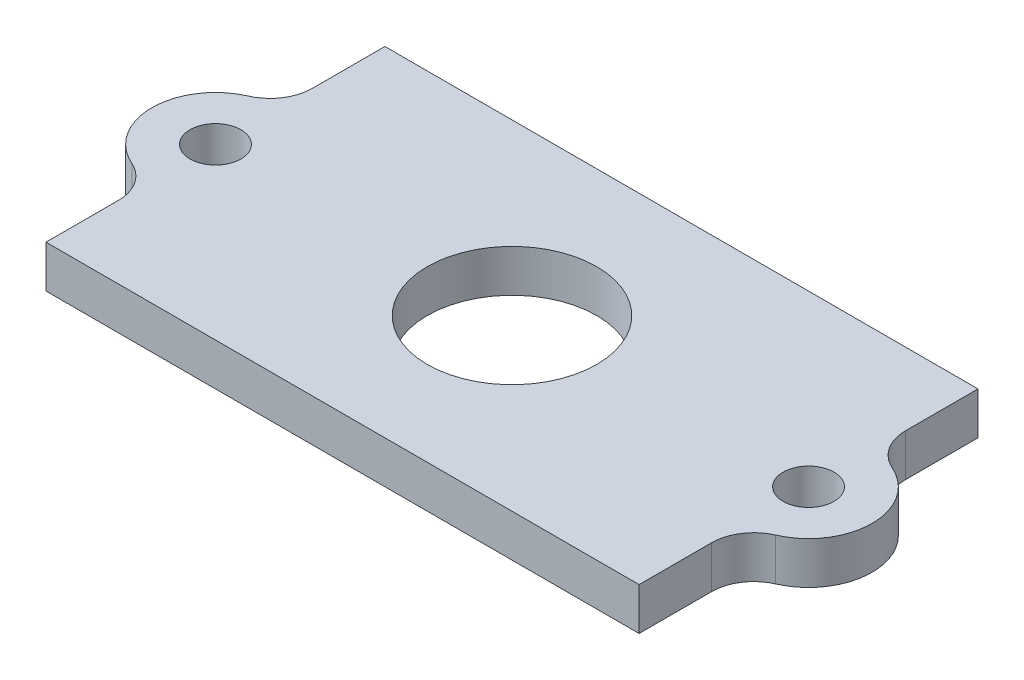
ISO-10303-21;
HEADER;
FILE_DESCRIPTION(('STEP AP214'),'2;1');
FILE_NAME('part.step','',(''),(''),'','','');
FILE_SCHEMA(('AUTOMOTIVE_DESIGN { 1 0 10303 214 1 1 1 1 }'));
ENDSEC;
DATA;
#1=APPLICATION_CONTEXT('core data for automotive mechanical design processes');
#2=APPLICATION_PROTOCOL_DEFINITION('international standard','automotive_design',2000,#1);
#3=PRODUCT_CONTEXT('',#1,'mechanical');
#4=PRODUCT('Part','Part','',(#3));
#5=PRODUCT_RELATED_PRODUCT_CATEGORY('part','',(#4));
#6=PRODUCT_DEFINITION_FORMATION('','',#4);
#7=PRODUCT_DEFINITION_CONTEXT('part definition',#1,'design');
#8=PRODUCT_DEFINITION('design','',#6,#7);
#9=PRODUCT_DEFINITION_SHAPE('','',#8);
#10=(LENGTH_UNIT() NAMED_UNIT(*) SI_UNIT(.MILLI.,.METRE.));
#11=(NAMED_UNIT(*) PLANE_ANGLE_UNIT() SI_UNIT($,.RADIAN.));
#12=(NAMED_UNIT(*) SI_UNIT($,.STERADIAN.) SOLID_ANGLE_UNIT());
#13=UNCERTAINTY_MEASURE_WITH_UNIT(LENGTH_MEASURE(1.E-05),#10,'distance_accuracy_value','');
#14=(GEOMETRIC_REPRESENTATION_CONTEXT(3) GLOBAL_UNCERTAINTY_ASSIGNED_CONTEXT((#13)) GLOBAL_UNIT_ASSIGNED_CONTEXT((#10,
#11,#12)) REPRESENTATION_CONTEXT('',''));
#15=CARTESIAN_POINT('',(0.,0.,0.));
#16=DIRECTION('',(0.,0.,1.));
#17=DIRECTION('',(1.,0.,0.));
#18=AXIS2_PLACEMENT_3D('',#15,#16,#17);
#19=CARTESIAN_POINT('',(-7.,0.,4.));
#20=DIRECTION('',(1.,0.,0.));
#21=DIRECTION('',(0.,0.,-1.));
#22=AXIS2_PLACEMENT_3D('',#19,#20,#21);
#23=PLANE('',#22);
#24=DIRECTION('',(0.,-1.,0.));
#25=VECTOR('',#24,1.);
#26=CARTESIAN_POINT('',(-7.,0.,4.));
#27=LINE('',#26,#25);
#28=CARTESIAN_POINT('',(-7.,1.,4.));
#29=VERTEX_POINT('',#28);
#30=CARTESIAN_POINT('',(-7.,0.,4.));
#31=VERTEX_POINT('',#30);
#32=EDGE_CURVE('E211',#29,#31,#27,.T.);
#33=ORIENTED_EDGE('',*,*,#32,.F.);
#34=DIRECTION('',(0.,0.,1.));
#35=VECTOR('',#34,1.);
#36=CARTESIAN_POINT('',(-7.,1.,0.));
#37=LINE('',#36,#35);
#38=CARTESIAN_POINT('',(-7.,1.,2.29128784747792));
#39=VERTEX_POINT('',#38);
#40=EDGE_CURVE('E136',#39,#29,#37,.T.);
#41=ORIENTED_EDGE('',*,*,#40,.F.);
#42=DIRECTION('',(0.,-1.,0.));
#43=VECTOR('',#42,1.);
#44=CARTESIAN_POINT('',(-7.,0.,2.29128784747792));
#45=LINE('',#44,#43);
#46=CARTESIAN_POINT('',(-7.,0.,2.29128784747792));
#47=VERTEX_POINT('',#46);
#48=EDGE_CURVE('E181',#39,#47,#45,.T.);
#49=ORIENTED_EDGE('',*,*,#48,.T.);
#50=DIRECTION('',(0.,0.,-1.));
#51=VECTOR('',#50,1.);
#52=CARTESIAN_POINT('',(-7.,0.,4.));
#53=LINE('',#52,#51);
#54=EDGE_CURVE('E158',#31,#47,#53,.T.);
#55=ORIENTED_EDGE('',*,*,#54,.F.);
#56=EDGE_LOOP('',(#33,#41,#49,#55));
#57=FACE_BOUND('',#56,.T.);
#58=ADVANCED_FACE('F38',(#57),#23,.F.);
#59=CARTESIAN_POINT('',(7.,8.,4.));
#60=DIRECTION('',(-1.,0.,0.));
#61=DIRECTION('',(0.,-1.,0.));
#62=AXIS2_PLACEMENT_3D('',#59,#60,#61);
#63=PLANE('',#62);
#64=DIRECTION('',(0.,1.,0.));
#65=VECTOR('',#64,1.);
#66=CARTESIAN_POINT('',(7.,8.,-4.));
#67=LINE('',#66,#65);
#68=CARTESIAN_POINT('',(7.,0.,-4.));
#69=VERTEX_POINT('',#68);
#70=CARTESIAN_POINT('',(7.,1.,-4.));
#71=VERTEX_POINT('',#70);
#72=EDGE_CURVE('E135',#69,#71,#67,.T.);
#73=ORIENTED_EDGE('',*,*,#72,.T.);
#74=DIRECTION('',(0.,0.,1.));
#75=VECTOR('',#74,1.);
#76=CARTESIAN_POINT('',(7.,1.,0.));
#77=LINE('',#76,#75);
#78=CARTESIAN_POINT('',(7.,1.,-2.29128784747792));
#79=VERTEX_POINT('',#78);
#80=EDGE_CURVE('E142',#71,#79,#77,.T.);
#81=ORIENTED_EDGE('',*,*,#80,.T.);
#82=DIRECTION('',(0.,1.,0.));
#83=VECTOR('',#82,1.);
#84=CARTESIAN_POINT('',(7.,0.,-2.29128784747792));
#85=LINE('',#84,#83);
#86=CARTESIAN_POINT('',(7.,0.,-2.29128784747792));
#87=VERTEX_POINT('',#86);
#88=EDGE_CURVE('E172',#79,#87,#85,.F.);
#89=ORIENTED_EDGE('',*,*,#88,.T.);
#90=DIRECTION('',(0.,0.,-1.));
#91=VECTOR('',#90,1.);
#92=CARTESIAN_POINT('',(7.,0.,4.));
#93=LINE('',#92,#91);
#94=EDGE_CURVE('E161',#87,#69,#93,.T.);
#95=ORIENTED_EDGE('',*,*,#94,.T.);
#96=EDGE_LOOP('',(#73,#81,#89,#95));
#97=FACE_BOUND('',#96,.T.);
#98=ADVANCED_FACE('F257',(#97),#63,.F.);
#99=CARTESIAN_POINT('',(7.,1.,2.29128784747792));
#100=VERTEX_POINT('',#99);
#101=CARTESIAN_POINT('',(7.,1.,4.));
#102=VERTEX_POINT('',#101);
#103=EDGE_CURVE('E214',#100,#102,#77,.T.);
#104=ORIENTED_EDGE('',*,*,#103,.T.);
#105=DIRECTION('',(0.,1.,0.));
#106=VECTOR('',#105,1.);
#107=CARTESIAN_POINT('',(7.,8.,4.));
#108=LINE('',#107,#106);
#109=CARTESIAN_POINT('',(7.,0.,4.));
#110=VERTEX_POINT('',#109);
#111=EDGE_CURVE('E220',#110,#102,#108,.T.);
#112=ORIENTED_EDGE('',*,*,#111,.F.);
#113=CARTESIAN_POINT('',(7.,0.,2.29128784747792));
#114=VERTEX_POINT('',#113);
#115=EDGE_CURVE('E163',#110,#114,#93,.T.);
#116=ORIENTED_EDGE('',*,*,#115,.T.);
#117=DIRECTION('',(0.,1.,0.));
#118=VECTOR('',#117,1.);
#119=CARTESIAN_POINT('',(7.,1.,2.29128784747792));
#120=LINE('',#119,#118);
#121=EDGE_CURVE('E174',#114,#100,#120,.T.);
#122=ORIENTED_EDGE('',*,*,#121,.T.);
#123=EDGE_LOOP('',(#104,#112,#116,#122));
#124=FACE_BOUND('',#123,.T.);
#125=ADVANCED_FACE('F238',(#124),#63,.F.);
#126=CARTESIAN_POINT('',(-7.,1.,-4.));
#127=VERTEX_POINT('',#126);
#128=CARTESIAN_POINT('',(-7.,1.,-2.29128784747792));
#129=VERTEX_POINT('',#128);
#130=EDGE_CURVE('E126',#127,#129,#37,.T.);
#131=ORIENTED_EDGE('',*,*,#130,.F.);
#132=DIRECTION('',(0.,-1.,0.));
#133=VECTOR('',#132,1.);
#134=CARTESIAN_POINT('',(-7.,0.,-4.));
#135=LINE('',#134,#133);
#136=CARTESIAN_POINT('',(-7.,0.,-4.));
#137=VERTEX_POINT('',#136);
#138=EDGE_CURVE('E131',#127,#137,#135,.T.);
#139=ORIENTED_EDGE('',*,*,#138,.T.);
#140=CARTESIAN_POINT('',(-7.,0.,-2.29128784747792));
#141=VERTEX_POINT('',#140);
#142=EDGE_CURVE('E162',#141,#137,#53,.T.);
#143=ORIENTED_EDGE('',*,*,#142,.F.);
#144=DIRECTION('',(0.,-1.,0.));
#145=VECTOR('',#144,1.);
#146=CARTESIAN_POINT('',(-7.,0.,-2.29128784747792));
#147=LINE('',#146,#145);
#148=EDGE_CURVE('E134',#141,#129,#147,.F.);
#149=ORIENTED_EDGE('',*,*,#148,.T.);
#150=EDGE_LOOP('',(#131,#139,#143,#149));
#151=FACE_BOUND('',#150,.T.);
#152=ADVANCED_FACE('F128',(#151),#23,.F.);
#153=CARTESIAN_POINT('',(0.,0.,4.));
#154=DIRECTION('',(0.,0.,-1.));
#155=DIRECTION('',(-1.,0.,0.));
#156=AXIS2_PLACEMENT_3D('',#153,#154,#155);
#157=PLANE('',#156);
#158=DIRECTION('',(1.,0.,0.));
#159=VECTOR('',#158,1.);
#160=CARTESIAN_POINT('',(0.,1.,4.));
#161=LINE('',#160,#159);
#162=EDGE_CURVE('E146',#29,#102,#161,.T.);
#163=ORIENTED_EDGE('',*,*,#162,.F.);
#164=ORIENTED_EDGE('',*,*,#32,.T.);
#165=DIRECTION('',(1.,0.,0.));
#166=VECTOR('',#165,1.);
#167=CARTESIAN_POINT('',(7.,0.,4.));
#168=LINE('',#167,#166);
#169=EDGE_CURVE('E153',#31,#110,#168,.T.);
#170=ORIENTED_EDGE('',*,*,#169,.T.);
#171=ORIENTED_EDGE('',*,*,#111,.T.);
#172=EDGE_LOOP('',(#163,#164,#170,#171));
#173=FACE_BOUND('',#172,.T.);
#174=ADVANCED_FACE('F243',(#173),#157,.F.);
#175=CARTESIAN_POINT('',(0.,0.,-4.));
#176=DIRECTION('',(0.,0.,-1.));
#177=DIRECTION('',(-1.,0.,0.));
#178=AXIS2_PLACEMENT_3D('',#175,#176,#177);
#179=PLANE('',#178);
#180=ORIENTED_EDGE('',*,*,#138,.F.);
#181=DIRECTION('',(1.,0.,0.));
#182=VECTOR('',#181,1.);
#183=CARTESIAN_POINT('',(0.,1.,-4.));
#184=LINE('',#183,#182);
#185=EDGE_CURVE('E139',#127,#71,#184,.T.);
#186=ORIENTED_EDGE('',*,*,#185,.T.);
#187=ORIENTED_EDGE('',*,*,#72,.F.);
#188=DIRECTION('',(1.,0.,0.));
#189=VECTOR('',#188,1.);
#190=CARTESIAN_POINT('',(0.,0.,-4.));
#191=LINE('',#190,#189);
#192=EDGE_CURVE('E151',#137,#69,#191,.T.);
#193=ORIENTED_EDGE('',*,*,#192,.F.);
#194=EDGE_LOOP('',(#180,#186,#187,#193));
#195=FACE_BOUND('',#194,.T.);
#196=ADVANCED_FACE('F149',(#195),#179,.T.);
#197=CARTESIAN_POINT('',(0.,0.,4.));
#198=DIRECTION('',(0.,1.,0.));
#199=DIRECTION('',(-1.,0.,0.));
#200=AXIS2_PLACEMENT_3D('',#197,#198,#199);
#201=PLANE('',#200);
#202=CARTESIAN_POINT('',(0.,0.,0.));
#203=DIRECTION('',(0.,-1.,0.));
#204=DIRECTION('',(1.,0.,0.));
#205=AXIS2_PLACEMENT_3D('',#202,#203,#204);
#206=CIRCLE('',#205,2.);
#207=CARTESIAN_POINT('',(2.,0.,0.));
#208=VERTEX_POINT('',#207);
#209=EDGE_CURVE('E241',#208,#208,#206,.T.);
#210=ORIENTED_EDGE('',*,*,#209,.F.);
#211=EDGE_LOOP('',(#210));
#212=FACE_BOUND('',#211,.T.);
#213=CARTESIAN_POINT('',(-7.,0.,0.));
#214=DIRECTION('',(0.,-1.,0.));
#215=DIRECTION('',(1.,0.,0.));
#216=AXIS2_PLACEMENT_3D('',#213,#214,#215);
#217=CIRCLE('',#216,0.6);
#218=CARTESIAN_POINT('',(-6.4,0.,0.));
#219=VERTEX_POINT('',#218);
#220=EDGE_CURVE('E313',#219,#219,#217,.T.);
#221=ORIENTED_EDGE('',*,*,#220,.F.);
#222=EDGE_LOOP('',(#221));
#223=FACE_BOUND('',#222,.T.);
#224=CARTESIAN_POINT('',(7.,0.,0.));
#225=DIRECTION('',(0.,-1.,0.));
#226=DIRECTION('',(1.,0.,0.));
#227=AXIS2_PLACEMENT_3D('',#224,#225,#226);
#228=CIRCLE('',#227,0.6);
#229=CARTESIAN_POINT('',(7.6,0.,0.));
#230=VERTEX_POINT('',#229);
#231=EDGE_CURVE('E231',#230,#230,#228,.T.);
#232=ORIENTED_EDGE('',*,*,#231,.F.);
#233=EDGE_LOOP('',(#232));
#234=FACE_BOUND('',#233,.T.);
#235=ORIENTED_EDGE('',*,*,#54,.T.);
#236=CARTESIAN_POINT('',(-8.,0.,2.29128784747792));
#237=DIRECTION('',(0.,1.,0.));
#238=DIRECTION('',(-1.,0.,0.));
#239=AXIS2_PLACEMENT_3D('',#236,#237,#238);
#240=CIRCLE('',#239,1.);
#241=CARTESIAN_POINT('',(-7.6,0.,1.37477270848675));
#242=VERTEX_POINT('',#241);
#243=EDGE_CURVE('E46',#47,#242,#240,.T.);
#244=ORIENTED_EDGE('',*,*,#243,.T.);
#245=CARTESIAN_POINT('',(-7.,0.,0.));
#246=DIRECTION('',(0.,-1.,0.));
#247=DIRECTION('',(1.,0.,0.));
#248=AXIS2_PLACEMENT_3D('',#245,#246,#247);
#249=CIRCLE('',#248,1.5);
#250=CARTESIAN_POINT('',(-7.6,0.,-1.37477270848675));
#251=VERTEX_POINT('',#250);
#252=EDGE_CURVE('E198',#242,#251,#249,.T.);
#253=ORIENTED_EDGE('',*,*,#252,.T.);
#254=CARTESIAN_POINT('',(-8.,0.,-2.29128784747792));
#255=DIRECTION('',(0.,1.,0.));
#256=DIRECTION('',(-1.,0.,0.));
#257=AXIS2_PLACEMENT_3D('',#254,#255,#256);
#258=CIRCLE('',#257,1.);
#259=EDGE_CURVE('E193',#251,#141,#258,.T.);
#260=ORIENTED_EDGE('',*,*,#259,.T.);
#261=ORIENTED_EDGE('',*,*,#142,.T.);
#262=ORIENTED_EDGE('',*,*,#192,.T.);
#263=ORIENTED_EDGE('',*,*,#94,.F.);
#264=CARTESIAN_POINT('',(8.,0.,-2.29128784747792));
#265=DIRECTION('',(0.,1.,0.));
#266=DIRECTION('',(-1.,0.,0.));
#267=AXIS2_PLACEMENT_3D('',#264,#265,#266);
#268=CIRCLE('',#267,1.);
#269=CARTESIAN_POINT('',(7.6,0.,-1.37477270848675));
#270=VERTEX_POINT('',#269);
#271=EDGE_CURVE('E185',#87,#270,#268,.T.);
#272=ORIENTED_EDGE('',*,*,#271,.T.);
#273=CARTESIAN_POINT('',(7.,0.,0.));
#274=DIRECTION('',(0.,-1.,0.));
#275=DIRECTION('',(1.,0.,0.));
#276=AXIS2_PLACEMENT_3D('',#273,#274,#275);
#277=CIRCLE('',#276,1.5);
#278=CARTESIAN_POINT('',(7.6,0.,1.37477270848675));
#279=VERTEX_POINT('',#278);
#280=EDGE_CURVE('E226',#279,#270,#277,.F.);
#281=ORIENTED_EDGE('',*,*,#280,.F.);
#282=CARTESIAN_POINT('',(8.,0.,2.29128784747792));
#283=DIRECTION('',(0.,1.,0.));
#284=DIRECTION('',(-1.,0.,0.));
#285=AXIS2_PLACEMENT_3D('',#282,#283,#284);
#286=CIRCLE('',#285,1.);
#287=EDGE_CURVE('E187',#279,#114,#286,.T.);
#288=ORIENTED_EDGE('',*,*,#287,.T.);
#289=ORIENTED_EDGE('',*,*,#115,.F.);
#290=ORIENTED_EDGE('',*,*,#169,.F.);
#291=EDGE_LOOP('',(#235,#244,#253,#260,#261,#262,#263,#272,#281,#288,#289,#290));
#292=FACE_BOUND('',#291,.T.);
#293=ADVANCED_FACE('F197',(#212,#223,#234,#292),#201,.F.);
#294=CARTESIAN_POINT('',(-7.,1.,0.));
#295=DIRECTION('',(0.,1.,0.));
#296=DIRECTION('',(0.,0.,1.));
#297=AXIS2_PLACEMENT_3D('',#294,#295,#296);
#298=PLANE('',#297);
#299=CARTESIAN_POINT('',(0.,1.,0.));
#300=DIRECTION('',(0.,-1.,0.));
#301=DIRECTION('',(1.,0.,0.));
#302=AXIS2_PLACEMENT_3D('',#299,#300,#301);
#303=CIRCLE('',#302,2.);
#304=CARTESIAN_POINT('',(2.,1.,0.));
#305=VERTEX_POINT('',#304);
#306=EDGE_CURVE('E318',#305,#305,#303,.T.);
#307=ORIENTED_EDGE('',*,*,#306,.T.);
#308=EDGE_LOOP('',(#307));
#309=FACE_BOUND('',#308,.T.);
#310=CARTESIAN_POINT('',(-7.,0.999999999999999,0.));
#311=DIRECTION('',(0.,-1.,0.));
#312=DIRECTION('',(1.,0.,0.));
#313=AXIS2_PLACEMENT_3D('',#310,#311,#312);
#314=CIRCLE('',#313,0.6);
#315=CARTESIAN_POINT('',(-6.4,0.999999999999999,0.));
#316=VERTEX_POINT('',#315);
#317=EDGE_CURVE('E207',#316,#316,#314,.T.);
#318=ORIENTED_EDGE('',*,*,#317,.T.);
#319=EDGE_LOOP('',(#318));
#320=FACE_BOUND('',#319,.T.);
#321=CARTESIAN_POINT('',(7.,1.,0.));
#322=DIRECTION('',(0.,-1.,0.));
#323=DIRECTION('',(1.,0.,0.));
#324=AXIS2_PLACEMENT_3D('',#321,#322,#323);
#325=CIRCLE('',#324,0.6);
#326=CARTESIAN_POINT('',(7.6,1.,0.));
#327=VERTEX_POINT('',#326);
#328=EDGE_CURVE('E317',#327,#327,#325,.T.);
#329=ORIENTED_EDGE('',*,*,#328,.T.);
#330=EDGE_LOOP('',(#329));
#331=FACE_BOUND('',#330,.T.);
#332=ORIENTED_EDGE('',*,*,#130,.T.);
#333=CARTESIAN_POINT('',(-8.,1.,-2.29128784747792));
#334=DIRECTION('',(0.,1.,0.));
#335=DIRECTION('',(0.,0.,1.));
#336=AXIS2_PLACEMENT_3D('',#333,#334,#335);
#337=CIRCLE('',#336,1.);
#338=CARTESIAN_POINT('',(-7.6,0.999999999999999,-1.37477270848675));
#339=VERTEX_POINT('',#338);
#340=EDGE_CURVE('E191',#129,#339,#337,.F.);
#341=ORIENTED_EDGE('',*,*,#340,.T.);
#342=CARTESIAN_POINT('',(-7.,0.999999999999999,0.));
#343=DIRECTION('',(0.,-1.,0.));
#344=DIRECTION('',(1.,0.,0.));
#345=AXIS2_PLACEMENT_3D('',#342,#343,#344);
#346=CIRCLE('',#345,1.5);
#347=CARTESIAN_POINT('',(-7.6,0.999999999999999,1.37477270848675));
#348=VERTEX_POINT('',#347);
#349=EDGE_CURVE('E206',#348,#339,#346,.T.);
#350=ORIENTED_EDGE('',*,*,#349,.F.);
#351=CARTESIAN_POINT('',(-8.,1.,2.29128784747792));
#352=DIRECTION('',(0.,1.,0.));
#353=DIRECTION('',(0.,0.,1.));
#354=AXIS2_PLACEMENT_3D('',#351,#352,#353);
#355=CIRCLE('',#354,1.);
#356=EDGE_CURVE('E11',#348,#39,#355,.F.);
#357=ORIENTED_EDGE('',*,*,#356,.T.);
#358=ORIENTED_EDGE('',*,*,#40,.T.);
#359=ORIENTED_EDGE('',*,*,#162,.T.);
#360=ORIENTED_EDGE('',*,*,#103,.F.);
#361=CARTESIAN_POINT('',(8.,1.,2.29128784747792));
#362=DIRECTION('',(0.,1.,0.));
#363=DIRECTION('',(0.,0.,1.));
#364=AXIS2_PLACEMENT_3D('',#361,#362,#363);
#365=CIRCLE('',#364,1.);
#366=CARTESIAN_POINT('',(7.6,1.,1.37477270848675));
#367=VERTEX_POINT('',#366);
#368=EDGE_CURVE('E189',#100,#367,#365,.F.);
#369=ORIENTED_EDGE('',*,*,#368,.T.);
#370=CARTESIAN_POINT('',(7.,1.,0.));
#371=DIRECTION('',(0.,-1.,0.));
#372=DIRECTION('',(1.,0.,0.));
#373=AXIS2_PLACEMENT_3D('',#370,#371,#372);
#374=CIRCLE('',#373,1.5);
#375=CARTESIAN_POINT('',(7.6,1.,-1.37477270848675));
#376=VERTEX_POINT('',#375);
#377=EDGE_CURVE('E229',#367,#376,#374,.F.);
#378=ORIENTED_EDGE('',*,*,#377,.T.);
#379=CARTESIAN_POINT('',(8.,1.,-2.29128784747792));
#380=DIRECTION('',(0.,1.,0.));
#381=DIRECTION('',(0.,0.,1.));
#382=AXIS2_PLACEMENT_3D('',#379,#380,#381);
#383=CIRCLE('',#382,1.);
#384=EDGE_CURVE('E183',#376,#79,#383,.F.);
#385=ORIENTED_EDGE('',*,*,#384,.T.);
#386=ORIENTED_EDGE('',*,*,#80,.F.);
#387=ORIENTED_EDGE('',*,*,#185,.F.);
#388=EDGE_LOOP('',(#332,#341,#350,#357,#358,#359,#360,#369,#378,#385,#386,#387));
#389=FACE_BOUND('',#388,.T.);
#390=ADVANCED_FACE('F140',(#309,#320,#331,#389),#298,.T.);
#391=CARTESIAN_POINT('',(7.,1.,0.));
#392=DIRECTION('',(0.,-1.,0.));
#393=DIRECTION('',(1.,0.,0.));
#394=AXIS2_PLACEMENT_3D('',#391,#392,#393);
#395=CYLINDRICAL_SURFACE('',#394,1.5);
#396=ORIENTED_EDGE('',*,*,#280,.T.);
#397=DIRECTION('',(0.,-1.,0.));
#398=VECTOR('',#397,1.);
#399=CARTESIAN_POINT('',(7.6,1.,-1.37477270848675));
#400=LINE('',#399,#398);
#401=EDGE_CURVE('E169',#270,#376,#400,.F.);
#402=ORIENTED_EDGE('',*,*,#401,.T.);
#403=ORIENTED_EDGE('',*,*,#377,.F.);
#404=DIRECTION('',(0.,-1.,0.));
#405=VECTOR('',#404,1.);
#406=CARTESIAN_POINT('',(7.6,1.,1.37477270848675));
#407=LINE('',#406,#405);
#408=EDGE_CURVE('E166',#367,#279,#407,.T.);
#409=ORIENTED_EDGE('',*,*,#408,.T.);
#410=EDGE_LOOP('',(#396,#402,#403,#409));
#411=FACE_BOUND('',#410,.T.);
#412=ADVANCED_FACE('F250',(#411),#395,.T.);
#413=CARTESIAN_POINT('',(-7.,0.999999999999999,0.));
#414=DIRECTION('',(0.,-1.,0.));
#415=DIRECTION('',(1.,0.,0.));
#416=AXIS2_PLACEMENT_3D('',#413,#414,#415);
#417=CYLINDRICAL_SURFACE('',#416,1.5);
#418=ORIENTED_EDGE('',*,*,#349,.T.);
#419=DIRECTION('',(0.,-1.,0.));
#420=VECTOR('',#419,1.);
#421=CARTESIAN_POINT('',(-7.6,0.999999999999999,-1.37477270848675));
#422=LINE('',#421,#420);
#423=EDGE_CURVE('E179',#339,#251,#422,.T.);
#424=ORIENTED_EDGE('',*,*,#423,.T.);
#425=ORIENTED_EDGE('',*,*,#252,.F.);
#426=DIRECTION('',(0.,-1.,0.));
#427=VECTOR('',#426,1.);
#428=CARTESIAN_POINT('',(-7.6,0.999999999999999,1.37477270848675));
#429=LINE('',#428,#427);
#430=EDGE_CURVE('E177',#242,#348,#429,.F.);
#431=ORIENTED_EDGE('',*,*,#430,.T.);
#432=EDGE_LOOP('',(#418,#424,#425,#431));
#433=FACE_BOUND('',#432,.T.);
#434=ADVANCED_FACE('F204',(#433),#417,.T.);
#435=CARTESIAN_POINT('',(7.,1.,0.));
#436=DIRECTION('',(0.,-1.,0.));
#437=DIRECTION('',(1.,0.,0.));
#438=AXIS2_PLACEMENT_3D('',#435,#436,#437);
#439=CYLINDRICAL_SURFACE('',#438,0.6);
#440=ORIENTED_EDGE('',*,*,#328,.F.);
#441=EDGE_LOOP('',(#440));
#442=FACE_BOUND('',#441,.T.);
#443=ORIENTED_EDGE('',*,*,#231,.T.);
#444=EDGE_LOOP('',(#443));
#445=FACE_BOUND('',#444,.T.);
#446=ADVANCED_FACE('F288',(#442,#445),#439,.F.);
#447=CARTESIAN_POINT('',(-7.,0.999999999999999,0.));
#448=DIRECTION('',(0.,-1.,0.));
#449=DIRECTION('',(1.,0.,0.));
#450=AXIS2_PLACEMENT_3D('',#447,#448,#449);
#451=CYLINDRICAL_SURFACE('',#450,0.6);
#452=ORIENTED_EDGE('',*,*,#317,.F.);
#453=EDGE_LOOP('',(#452));
#454=FACE_BOUND('',#453,.T.);
#455=ORIENTED_EDGE('',*,*,#220,.T.);
#456=EDGE_LOOP('',(#455));
#457=FACE_BOUND('',#456,.T.);
#458=ADVANCED_FACE('F269',(#454,#457),#451,.F.);
#459=CARTESIAN_POINT('',(8.,1.,-2.29128784747792));
#460=DIRECTION('',(0.,-1.,0.));
#461=DIRECTION('',(1.,0.,0.));
#462=AXIS2_PLACEMENT_3D('',#459,#460,#461);
#463=CYLINDRICAL_SURFACE('',#462,1.);
#464=ORIENTED_EDGE('',*,*,#271,.F.);
#465=ORIENTED_EDGE('',*,*,#88,.F.);
#466=ORIENTED_EDGE('',*,*,#384,.F.);
#467=ORIENTED_EDGE('',*,*,#401,.F.);
#468=EDGE_LOOP('',(#464,#465,#466,#467));
#469=FACE_BOUND('',#468,.T.);
#470=ADVANCED_FACE('F254',(#469),#463,.F.);
#471=CARTESIAN_POINT('',(8.,1.,2.29128784747792));
#472=DIRECTION('',(0.,-1.,0.));
#473=DIRECTION('',(1.,0.,0.));
#474=AXIS2_PLACEMENT_3D('',#471,#472,#473);
#475=CYLINDRICAL_SURFACE('',#474,1.);
#476=ORIENTED_EDGE('',*,*,#368,.F.);
#477=ORIENTED_EDGE('',*,*,#121,.F.);
#478=ORIENTED_EDGE('',*,*,#287,.F.);
#479=ORIENTED_EDGE('',*,*,#408,.F.);
#480=EDGE_LOOP('',(#476,#477,#478,#479));
#481=FACE_BOUND('',#480,.T.);
#482=ADVANCED_FACE('F247',(#481),#475,.F.);
#483=CARTESIAN_POINT('',(-8.,0.999999999999999,-2.29128784747792));
#484=DIRECTION('',(0.,-1.,0.));
#485=DIRECTION('',(1.,0.,0.));
#486=AXIS2_PLACEMENT_3D('',#483,#484,#485);
#487=CYLINDRICAL_SURFACE('',#486,1.);
#488=ORIENTED_EDGE('',*,*,#259,.F.);
#489=ORIENTED_EDGE('',*,*,#423,.F.);
#490=ORIENTED_EDGE('',*,*,#340,.F.);
#491=ORIENTED_EDGE('',*,*,#148,.F.);
#492=EDGE_LOOP('',(#488,#489,#490,#491));
#493=FACE_BOUND('',#492,.T.);
#494=ADVANCED_FACE('F225',(#493),#487,.F.);
#495=CARTESIAN_POINT('',(-8.,0.999999999999999,2.29128784747792));
#496=DIRECTION('',(0.,-1.,0.));
#497=DIRECTION('',(1.,0.,0.));
#498=AXIS2_PLACEMENT_3D('',#495,#496,#497);
#499=CYLINDRICAL_SURFACE('',#498,1.);
#500=ORIENTED_EDGE('',*,*,#356,.F.);
#501=ORIENTED_EDGE('',*,*,#430,.F.);
#502=ORIENTED_EDGE('',*,*,#243,.F.);
#503=ORIENTED_EDGE('',*,*,#48,.F.);
#504=EDGE_LOOP('',(#500,#501,#502,#503));
#505=FACE_BOUND('',#504,.T.);
#506=ADVANCED_FACE('F40',(#505),#499,.F.);
#507=CARTESIAN_POINT('',(0.,1.,0.));
#508=DIRECTION('',(0.,-1.,0.));
#509=DIRECTION('',(1.,0.,0.));
#510=AXIS2_PLACEMENT_3D('',#507,#508,#509);
#511=CYLINDRICAL_SURFACE('',#510,2.);
#512=ORIENTED_EDGE('',*,*,#306,.F.);
#513=EDGE_LOOP('',(#512));
#514=FACE_BOUND('',#513,.T.);
#515=ORIENTED_EDGE('',*,*,#209,.T.);
#516=EDGE_LOOP('',(#515));
#517=FACE_BOUND('',#516,.T.);
#518=ADVANCED_FACE('F275',(#514,#517),#511,.F.);
#519=CLOSED_SHELL('',(#58,#98,#125,#152,#174,#196,#293,#390,#412,#434,#446,#458,#470,#482,#494,
#506,#518));
#520=MANIFOLD_SOLID_BREP('B2',#519);
#521=ADVANCED_BREP_SHAPE_REPRESENTATION('',(#18,#520),#14);
#522=SHAPE_DEFINITION_REPRESENTATION(#9,#521);
ENDSEC;
END-ISO-10303-21;
